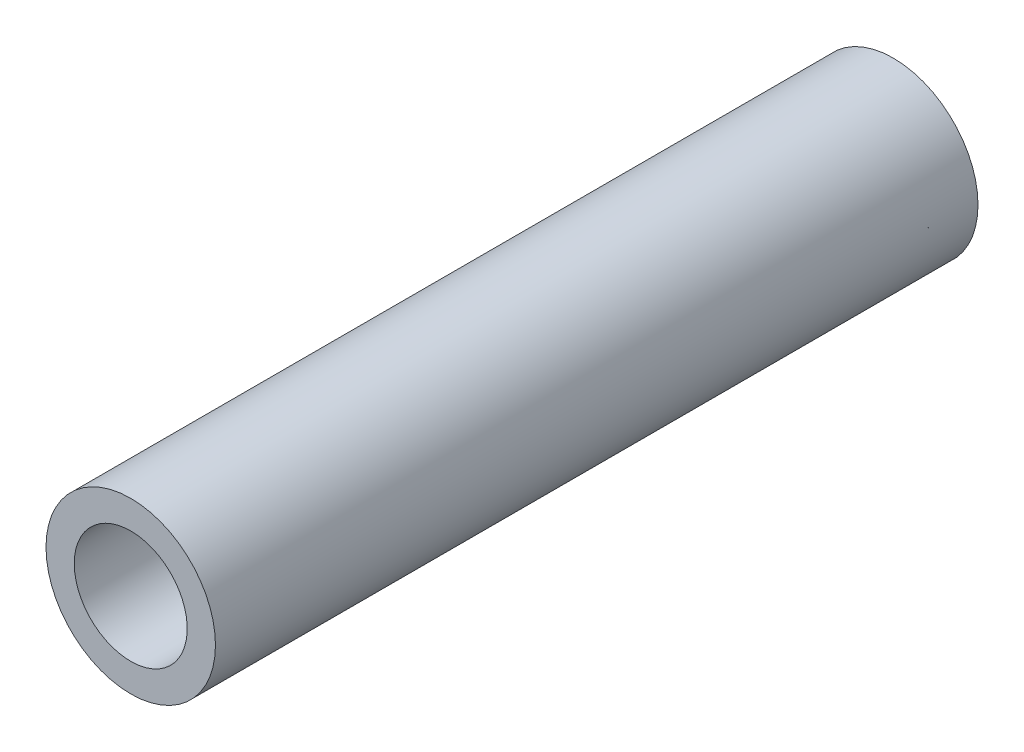
ISO-10303-21;
HEADER;
FILE_DESCRIPTION(('STEP AP214'),'2;1');
FILE_NAME('part.step','',(''),(''),'','','');
FILE_SCHEMA(('AUTOMOTIVE_DESIGN { 1 0 10303 214 1 1 1 1 }'));
ENDSEC;
DATA;
#1=APPLICATION_CONTEXT('core data for automotive mechanical design processes');
#2=APPLICATION_PROTOCOL_DEFINITION('international standard','automotive_design',2000,#1);
#3=PRODUCT_CONTEXT('',#1,'mechanical');
#4=PRODUCT('Part','Part','',(#3));
#5=PRODUCT_RELATED_PRODUCT_CATEGORY('part','',(#4));
#6=PRODUCT_DEFINITION_FORMATION('','',#4);
#7=PRODUCT_DEFINITION_CONTEXT('part definition',#1,'design');
#8=PRODUCT_DEFINITION('design','',#6,#7);
#9=PRODUCT_DEFINITION_SHAPE('','',#8);
#10=(LENGTH_UNIT() NAMED_UNIT(*) SI_UNIT(.MILLI.,.METRE.));
#11=(NAMED_UNIT(*) PLANE_ANGLE_UNIT() SI_UNIT($,.RADIAN.));
#12=(NAMED_UNIT(*) SI_UNIT($,.STERADIAN.) SOLID_ANGLE_UNIT());
#13=UNCERTAINTY_MEASURE_WITH_UNIT(LENGTH_MEASURE(1.E-05),#10,'distance_accuracy_value','');
#14=(GEOMETRIC_REPRESENTATION_CONTEXT(3) GLOBAL_UNCERTAINTY_ASSIGNED_CONTEXT((#13)) GLOBAL_UNIT_ASSIGNED_CONTEXT((#10,
#11,#12)) REPRESENTATION_CONTEXT('',''));
#15=CARTESIAN_POINT('',(0.,0.,0.));
#16=DIRECTION('',(0.,0.,1.));
#17=DIRECTION('',(1.,0.,0.));
#18=AXIS2_PLACEMENT_3D('',#15,#16,#17);
#19=CARTESIAN_POINT('',(13.,-54.5,0.));
#20=DIRECTION('',(0.,0.,1.));
#21=DIRECTION('',(1.,0.,0.));
#22=AXIS2_PLACEMENT_3D('',#19,#20,#21);
#23=PLANE('',#22);
#24=CARTESIAN_POINT('',(13.,-54.5,0.));
#25=DIRECTION('',(0.,0.,1.));
#26=DIRECTION('',(1.,0.,0.));
#27=AXIS2_PLACEMENT_3D('',#24,#25,#26);
#28=CIRCLE('',#27,3.);
#29=CARTESIAN_POINT('',(16.,-54.5,0.));
#30=VERTEX_POINT('',#29);
#31=EDGE_CURVE('E42',#30,#30,#28,.T.);
#32=ORIENTED_EDGE('',*,*,#31,.F.);
#33=EDGE_LOOP('',(#32));
#34=FACE_BOUND('',#33,.T.);
#35=CARTESIAN_POINT('',(13.,-54.5,0.));
#36=DIRECTION('',(0.,0.,1.));
#37=DIRECTION('',(1.,0.,0.));
#38=AXIS2_PLACEMENT_3D('',#35,#36,#37);
#39=CIRCLE('',#38,2.);
#40=CARTESIAN_POINT('',(15.,-54.5,0.));
#41=VERTEX_POINT('',#40);
#42=EDGE_CURVE('E54',#41,#41,#39,.T.);
#43=ORIENTED_EDGE('',*,*,#42,.T.);
#44=EDGE_LOOP('',(#43));
#45=FACE_BOUND('',#44,.T.);
#46=ADVANCED_FACE('F34',(#34,#45),#23,.F.);
#47=CARTESIAN_POINT('',(13.,-54.5,35.4852813742386));
#48=DIRECTION('',(0.,0.,-1.));
#49=DIRECTION('',(-1.,0.,0.));
#50=AXIS2_PLACEMENT_3D('',#47,#48,#49);
#51=CYLINDRICAL_SURFACE('',#50,3.);
#52=CARTESIAN_POINT('',(13.,-54.5,27.));
#53=DIRECTION('',(0.,0.,-1.));
#54=DIRECTION('',(-1.,0.,0.));
#55=AXIS2_PLACEMENT_3D('',#52,#53,#54);
#56=CIRCLE('',#55,3.);
#57=CARTESIAN_POINT('',(9.99999999999998,-54.5,27.));
#58=VERTEX_POINT('',#57);
#59=EDGE_CURVE('E48',#58,#58,#56,.T.);
#60=ORIENTED_EDGE('',*,*,#59,.T.);
#61=EDGE_LOOP('',(#60));
#62=FACE_BOUND('',#61,.T.);
#63=ORIENTED_EDGE('',*,*,#31,.T.);
#64=EDGE_LOOP('',(#63));
#65=FACE_BOUND('',#64,.T.);
#66=ADVANCED_FACE('F62',(#62,#65),#51,.T.);
#67=CARTESIAN_POINT('',(13.,-54.5,35.4852813742386));
#68=DIRECTION('',(0.,0.,-1.));
#69=DIRECTION('',(-1.,0.,0.));
#70=AXIS2_PLACEMENT_3D('',#67,#68,#69);
#71=CYLINDRICAL_SURFACE('',#70,2.);
#72=CARTESIAN_POINT('',(13.,-54.5,27.));
#73=DIRECTION('',(0.,0.,-1.));
#74=DIRECTION('',(-1.,0.,0.));
#75=AXIS2_PLACEMENT_3D('',#72,#73,#74);
#76=CIRCLE('',#75,2.);
#77=CARTESIAN_POINT('',(11.,-54.5,27.));
#78=VERTEX_POINT('',#77);
#79=EDGE_CURVE('E10',#78,#78,#76,.T.);
#80=ORIENTED_EDGE('',*,*,#79,.F.);
#81=EDGE_LOOP('',(#80));
#82=FACE_BOUND('',#81,.T.);
#83=ORIENTED_EDGE('',*,*,#42,.F.);
#84=EDGE_LOOP('',(#83));
#85=FACE_BOUND('',#84,.T.);
#86=ADVANCED_FACE('F60',(#82,#85),#71,.F.);
#87=CARTESIAN_POINT('',(35.5,0.,27.));
#88=DIRECTION('',(0.,0.,-1.));
#89=DIRECTION('',(1.,0.,0.));
#90=AXIS2_PLACEMENT_3D('',#87,#88,#89);
#91=PLANE('',#90);
#92=ORIENTED_EDGE('',*,*,#79,.T.);
#93=EDGE_LOOP('',(#92));
#94=FACE_BOUND('',#93,.T.);
#95=ORIENTED_EDGE('',*,*,#59,.F.);
#96=EDGE_LOOP('',(#95));
#97=FACE_BOUND('',#96,.T.);
#98=ADVANCED_FACE('F36',(#94,#97),#91,.F.);
#99=CLOSED_SHELL('',(#46,#66,#86,#98));
#100=MANIFOLD_SOLID_BREP('B2',#99);
#101=ADVANCED_BREP_SHAPE_REPRESENTATION('',(#18,#100),#14);
#102=SHAPE_DEFINITION_REPRESENTATION(#9,#101);
ENDSEC;
END-ISO-10303-21;
